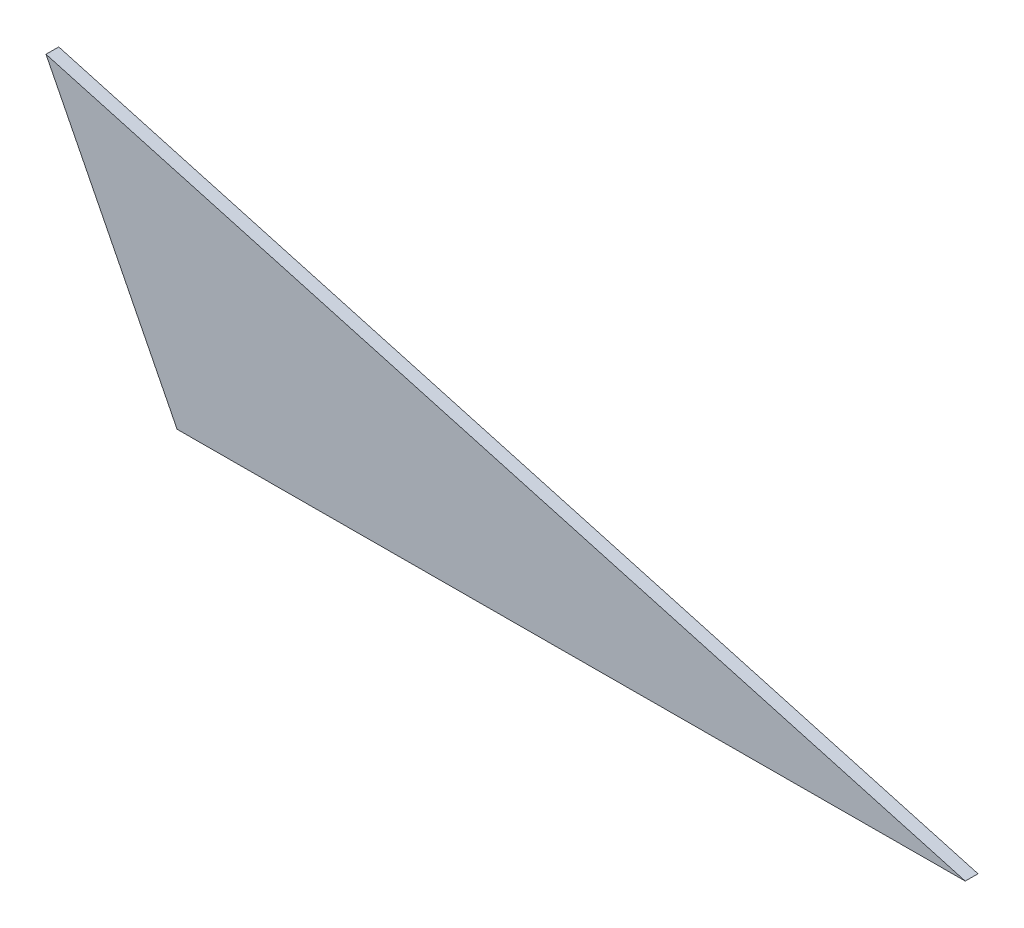
ISO-10303-21;
HEADER;
FILE_DESCRIPTION(('STEP AP214'),'2;1');
FILE_NAME('part.step','',(''),(''),'','','');
FILE_SCHEMA(('AUTOMOTIVE_DESIGN { 1 0 10303 214 1 1 1 1 }'));
ENDSEC;
DATA;
#1=APPLICATION_CONTEXT('core data for automotive mechanical design processes');
#2=APPLICATION_PROTOCOL_DEFINITION('international standard','automotive_design',2000,#1);
#3=PRODUCT_CONTEXT('',#1,'mechanical');
#4=PRODUCT('Part','Part','',(#3));
#5=PRODUCT_RELATED_PRODUCT_CATEGORY('part','',(#4));
#6=PRODUCT_DEFINITION_FORMATION('','',#4);
#7=PRODUCT_DEFINITION_CONTEXT('part definition',#1,'design');
#8=PRODUCT_DEFINITION('design','',#6,#7);
#9=PRODUCT_DEFINITION_SHAPE('','',#8);
#10=(LENGTH_UNIT() NAMED_UNIT(*) SI_UNIT(.MILLI.,.METRE.));
#11=(NAMED_UNIT(*) PLANE_ANGLE_UNIT() SI_UNIT($,.RADIAN.));
#12=(NAMED_UNIT(*) SI_UNIT($,.STERADIAN.) SOLID_ANGLE_UNIT());
#13=UNCERTAINTY_MEASURE_WITH_UNIT(LENGTH_MEASURE(1.E-05),#10,'distance_accuracy_value','');
#14=(GEOMETRIC_REPRESENTATION_CONTEXT(3) GLOBAL_UNCERTAINTY_ASSIGNED_CONTEXT((#13)) GLOBAL_UNIT_ASSIGNED_CONTEXT((#10,
#11,#12)) REPRESENTATION_CONTEXT('',''));
#15=CARTESIAN_POINT('',(0.,0.,0.));
#16=DIRECTION('',(0.,0.,1.));
#17=DIRECTION('',(1.,0.,0.));
#18=AXIS2_PLACEMENT_3D('',#15,#16,#17);
#19=CARTESIAN_POINT('',(-435.181198884943,102.54706182092,15.));
#20=DIRECTION('',(0.89236814351163,0.451308205604117,0.));
#21=DIRECTION('',(-0.451308205604117,0.89236814351163,0.));
#22=AXIS2_PLACEMENT_3D('',#19,#20,#21);
#23=PLANE('',#22);
#24=DIRECTION('',(0.451308205604117,-0.89236814351163,0.));
#25=VECTOR('',#24,1.);
#26=CARTESIAN_POINT('',(-435.181198884943,102.54706182092,0.));
#27=LINE('',#26,#25);
#28=CARTESIAN_POINT('',(-435.181198884943,102.54706182092,0.));
#29=VERTEX_POINT('',#28);
#30=CARTESIAN_POINT('',(-280.574961477087,-203.154627928521,0.));
#31=VERTEX_POINT('',#30);
#32=EDGE_CURVE('E89',#29,#31,#27,.T.);
#33=ORIENTED_EDGE('',*,*,#32,.T.);
#34=DIRECTION('',(0.,0.,-1.));
#35=VECTOR('',#34,1.);
#36=CARTESIAN_POINT('',(-280.574961477087,-203.154627928521,15.));
#37=LINE('',#36,#35);
#38=CARTESIAN_POINT('',(-280.574961477087,-203.154627928521,15.));
#39=VERTEX_POINT('',#38);
#40=EDGE_CURVE('E11',#39,#31,#37,.T.);
#41=ORIENTED_EDGE('',*,*,#40,.F.);
#42=DIRECTION('',(0.451308205604117,-0.89236814351163,0.));
#43=VECTOR('',#42,1.);
#44=CARTESIAN_POINT('',(-435.181198884943,102.54706182092,15.));
#45=LINE('',#44,#43);
#46=CARTESIAN_POINT('',(-435.181198884943,102.54706182092,15.));
#47=VERTEX_POINT('',#46);
#48=EDGE_CURVE('E81',#47,#39,#45,.T.);
#49=ORIENTED_EDGE('',*,*,#48,.F.);
#50=DIRECTION('',(0.,0.,-1.));
#51=VECTOR('',#50,1.);
#52=CARTESIAN_POINT('',(-435.181198884943,102.54706182092,15.));
#53=LINE('',#52,#51);
#54=EDGE_CURVE('E90',#47,#29,#53,.T.);
#55=ORIENTED_EDGE('',*,*,#54,.T.);
#56=EDGE_LOOP('',(#33,#41,#49,#55));
#57=FACE_BOUND('',#56,.T.);
#58=ADVANCED_FACE('F39',(#57),#23,.F.);
#59=CARTESIAN_POINT('',(-280.574961477087,-203.154627928521,15.));
#60=DIRECTION('',(-0.00356477116120639,0.999993646183098,0.));
#61=DIRECTION('',(-0.999993646183099,-0.0035647711612064,0.));
#62=AXIS2_PLACEMENT_3D('',#59,#60,#61);
#63=PLANE('',#62);
#64=DIRECTION('',(0.999993646183099,0.00356477116120639,0.));
#65=VECTOR('',#64,1.);
#66=CARTESIAN_POINT('',(-280.574961477087,-203.154627928521,0.));
#67=LINE('',#66,#65);
#68=CARTESIAN_POINT('',(648.852942115702,-199.841409089787,0.));
#69=VERTEX_POINT('',#68);
#70=EDGE_CURVE('E68',#31,#69,#67,.T.);
#71=ORIENTED_EDGE('',*,*,#70,.T.);
#72=DIRECTION('',(0.,0.,-1.));
#73=VECTOR('',#72,1.);
#74=CARTESIAN_POINT('',(648.852942115702,-199.841409089787,15.));
#75=LINE('',#74,#73);
#76=CARTESIAN_POINT('',(648.852942115702,-199.841409089787,15.));
#77=VERTEX_POINT('',#76);
#78=EDGE_CURVE('E48',#77,#69,#75,.T.);
#79=ORIENTED_EDGE('',*,*,#78,.F.);
#80=DIRECTION('',(0.999993646183099,0.00356477116120639,0.));
#81=VECTOR('',#80,1.);
#82=CARTESIAN_POINT('',(-280.574961477087,-203.154627928521,15.));
#83=LINE('',#82,#81);
#84=EDGE_CURVE('E76',#39,#77,#83,.T.);
#85=ORIENTED_EDGE('',*,*,#84,.F.);
#86=ORIENTED_EDGE('',*,*,#40,.T.);
#87=EDGE_LOOP('',(#71,#79,#85,#86));
#88=FACE_BOUND('',#87,.T.);
#89=ADVANCED_FACE('F77',(#88),#63,.F.);
#90=CARTESIAN_POINT('',(-435.181198884943,102.54706182092,15.));
#91=DIRECTION('',(-0.268689586533298,-0.96322681964767,0.));
#92=DIRECTION('',(0.96322681964767,-0.268689586533298,0.));
#93=AXIS2_PLACEMENT_3D('',#90,#91,#92);
#94=PLANE('',#93);
#95=DIRECTION('',(-0.96322681964767,0.268689586533298,0.));
#96=VECTOR('',#95,1.);
#97=CARTESIAN_POINT('',(-435.181198884943,102.54706182092,0.));
#98=LINE('',#97,#96);
#99=EDGE_CURVE('E73',#69,#29,#98,.T.);
#100=ORIENTED_EDGE('',*,*,#99,.T.);
#101=ORIENTED_EDGE('',*,*,#54,.F.);
#102=DIRECTION('',(-0.96322681964767,0.268689586533298,0.));
#103=VECTOR('',#102,1.);
#104=CARTESIAN_POINT('',(-435.181198884943,102.54706182092,15.));
#105=LINE('',#104,#103);
#106=EDGE_CURVE('E56',#77,#47,#105,.T.);
#107=ORIENTED_EDGE('',*,*,#106,.F.);
#108=ORIENTED_EDGE('',*,*,#78,.T.);
#109=EDGE_LOOP('',(#100,#101,#107,#108));
#110=FACE_BOUND('',#109,.T.);
#111=ADVANCED_FACE('F102',(#110),#94,.F.);
#112=CARTESIAN_POINT('',(0.,0.,15.));
#113=DIRECTION('',(0.,0.,1.));
#114=DIRECTION('',(1.,0.,0.));
#115=AXIS2_PLACEMENT_3D('',#112,#113,#114);
#116=PLANE('',#115);
#117=ORIENTED_EDGE('',*,*,#48,.T.);
#118=ORIENTED_EDGE('',*,*,#84,.T.);
#119=ORIENTED_EDGE('',*,*,#106,.T.);
#120=EDGE_LOOP('',(#117,#118,#119));
#121=FACE_BOUND('',#120,.T.);
#122=ADVANCED_FACE('F84',(#121),#116,.T.);
#123=CARTESIAN_POINT('',(0.,0.,0.));
#124=DIRECTION('',(0.,0.,1.));
#125=DIRECTION('',(1.,0.,0.));
#126=AXIS2_PLACEMENT_3D('',#123,#124,#125);
#127=PLANE('',#126);
#128=ORIENTED_EDGE('',*,*,#32,.F.);
#129=ORIENTED_EDGE('',*,*,#99,.F.);
#130=ORIENTED_EDGE('',*,*,#70,.F.);
#131=EDGE_LOOP('',(#128,#129,#130));
#132=FACE_BOUND('',#131,.T.);
#133=ADVANCED_FACE('F103',(#132),#127,.F.);
#134=CLOSED_SHELL('',(#58,#89,#111,#122,#133));
#135=MANIFOLD_SOLID_BREP('B2',#134);
#136=ADVANCED_BREP_SHAPE_REPRESENTATION('',(#18,#135),#14);
#137=SHAPE_DEFINITION_REPRESENTATION(#9,#136);
ENDSEC;
END-ISO-10303-21;
